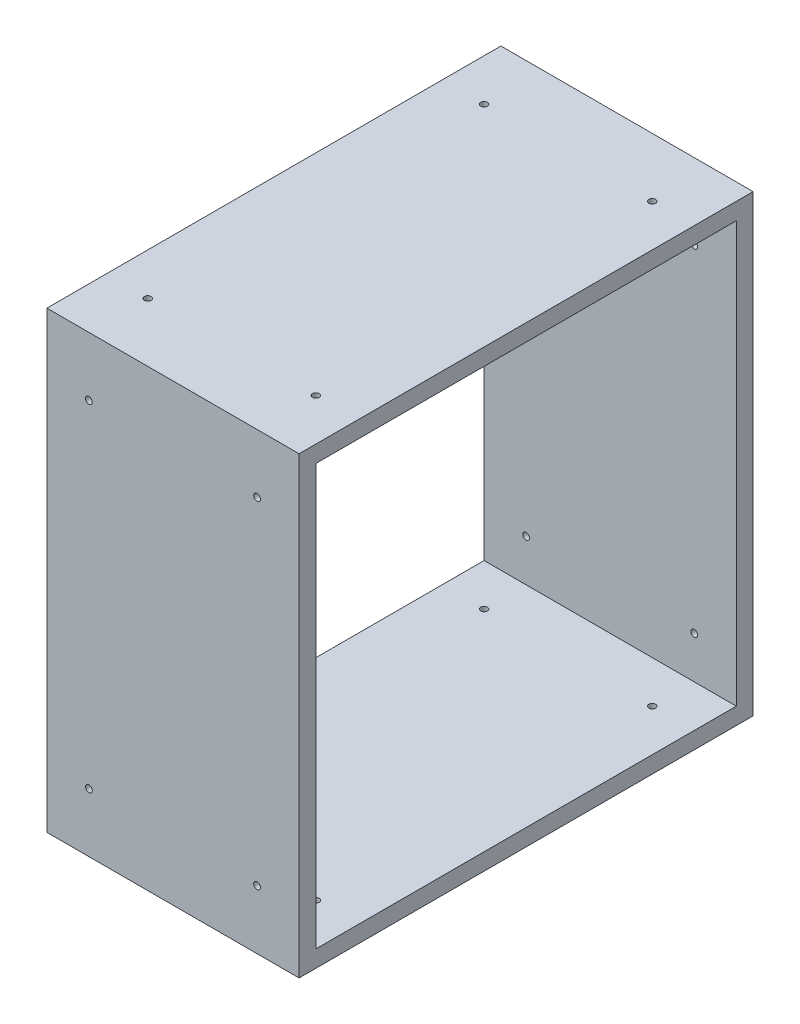
ISO-10303-21;
HEADER;
FILE_DESCRIPTION(('STEP AP214'),'2;1');
FILE_NAME('part.step','',(''),(''),'','','');
FILE_SCHEMA(('AUTOMOTIVE_DESIGN { 1 0 10303 214 1 1 1 1 }'));
ENDSEC;
DATA;
#1=APPLICATION_CONTEXT('core data for automotive mechanical design processes');
#2=APPLICATION_PROTOCOL_DEFINITION('international standard','automotive_design',2000,#1);
#3=PRODUCT_CONTEXT('',#1,'mechanical');
#4=PRODUCT('Part','Part','',(#3));
#5=PRODUCT_RELATED_PRODUCT_CATEGORY('part','',(#4));
#6=PRODUCT_DEFINITION_FORMATION('','',#4);
#7=PRODUCT_DEFINITION_CONTEXT('part definition',#1,'design');
#8=PRODUCT_DEFINITION('design','',#6,#7);
#9=PRODUCT_DEFINITION_SHAPE('','',#8);
#10=(LENGTH_UNIT() NAMED_UNIT(*) SI_UNIT(.MILLI.,.METRE.));
#11=(NAMED_UNIT(*) PLANE_ANGLE_UNIT() SI_UNIT($,.RADIAN.));
#12=(NAMED_UNIT(*) SI_UNIT($,.STERADIAN.) SOLID_ANGLE_UNIT());
#13=UNCERTAINTY_MEASURE_WITH_UNIT(LENGTH_MEASURE(1.E-05),#10,'distance_accuracy_value','');
#14=(GEOMETRIC_REPRESENTATION_CONTEXT(3) GLOBAL_UNCERTAINTY_ASSIGNED_CONTEXT((#13)) GLOBAL_UNIT_ASSIGNED_CONTEXT((#10,
#11,#12)) REPRESENTATION_CONTEXT('',''));
#15=CARTESIAN_POINT('',(0.,0.,0.));
#16=DIRECTION('',(0.,0.,1.));
#17=DIRECTION('',(1.,0.,0.));
#18=AXIS2_PLACEMENT_3D('',#15,#16,#17);
#19=CARTESIAN_POINT('',(300.,0.,250.));
#20=DIRECTION('',(0.,0.,1.));
#21=DIRECTION('',(0.,-1.,0.));
#22=AXIS2_PLACEMENT_3D('',#19,#20,#21);
#23=PLANE('',#22);
#24=CARTESIAN_POINT('',(250.,200.,250.));
#25=DIRECTION('',(0.,0.,-1.));
#26=DIRECTION('',(0.,1.,0.));
#27=AXIS2_PLACEMENT_3D('',#24,#25,#26);
#28=CIRCLE('',#27,3.99999999999999);
#29=CARTESIAN_POINT('',(250.,204.,250.));
#30=VERTEX_POINT('',#29);
#31=EDGE_CURVE('E224',#30,#30,#28,.T.);
#32=ORIENTED_EDGE('',*,*,#31,.F.);
#33=EDGE_LOOP('',(#32));
#34=FACE_BOUND('',#33,.T.);
#35=CARTESIAN_POINT('',(50.,200.,250.));
#36=DIRECTION('',(0.,0.,-1.));
#37=DIRECTION('',(0.,1.,0.));
#38=AXIS2_PLACEMENT_3D('',#35,#36,#37);
#39=CIRCLE('',#38,4.00000000000001);
#40=CARTESIAN_POINT('',(50.,204.,250.));
#41=VERTEX_POINT('',#40);
#42=EDGE_CURVE('E228',#41,#41,#39,.T.);
#43=ORIENTED_EDGE('',*,*,#42,.F.);
#44=EDGE_LOOP('',(#43));
#45=FACE_BOUND('',#44,.T.);
#46=DIRECTION('',(0.,1.,0.));
#47=VECTOR('',#46,1.);
#48=CARTESIAN_POINT('',(0.,0.,250.));
#49=LINE('',#48,#47);
#50=CARTESIAN_POINT('',(0.,-249.999999999998,250.000000000002));
#51=VERTEX_POINT('',#50);
#52=CARTESIAN_POINT('',(0.,250.000000000001,249.999999999999));
#53=VERTEX_POINT('',#52);
#54=EDGE_CURVE('E133',#51,#53,#49,.T.);
#55=ORIENTED_EDGE('',*,*,#54,.T.);
#56=DIRECTION('',(-1.,0.,0.));
#57=VECTOR('',#56,1.);
#58=CARTESIAN_POINT('',(300.,250.000000000001,249.999999999999));
#59=LINE('',#58,#57);
#60=CARTESIAN_POINT('',(300.,250.,250.));
#61=VERTEX_POINT('',#60);
#62=EDGE_CURVE('E216',#61,#53,#59,.T.);
#63=ORIENTED_EDGE('',*,*,#62,.F.);
#64=DIRECTION('',(0.,1.,0.));
#65=VECTOR('',#64,1.);
#66=CARTESIAN_POINT('',(300.,0.,250.));
#67=LINE('',#66,#65);
#68=CARTESIAN_POINT('',(300.,-249.999999999997,250.000000000003));
#69=VERTEX_POINT('',#68);
#70=EDGE_CURVE('E49',#69,#61,#67,.T.);
#71=ORIENTED_EDGE('',*,*,#70,.F.);
#72=DIRECTION('',(-1.,0.,0.));
#73=VECTOR('',#72,1.);
#74=CARTESIAN_POINT('',(300.,-249.999999999998,250.000000000002));
#75=LINE('',#74,#73);
#76=EDGE_CURVE('E150',#69,#51,#75,.T.);
#77=ORIENTED_EDGE('',*,*,#76,.T.);
#78=EDGE_LOOP('',(#55,#63,#71,#77));
#79=FACE_BOUND('',#78,.T.);
#80=CARTESIAN_POINT('',(250.,-199.999999999997,250.000000000002));
#81=DIRECTION('',(0.,0.,1.));
#82=DIRECTION('',(0.,-1.,0.));
#83=AXIS2_PLACEMENT_3D('',#80,#81,#82);
#84=CIRCLE('',#83,3.99999999999999);
#85=CARTESIAN_POINT('',(250.,-203.999999999997,250.000000000002));
#86=VERTEX_POINT('',#85);
#87=EDGE_CURVE('E152',#86,#86,#84,.T.);
#88=ORIENTED_EDGE('',*,*,#87,.T.);
#89=EDGE_LOOP('',(#88));
#90=FACE_BOUND('',#89,.T.);
#91=CARTESIAN_POINT('',(50.,-199.999999999997,250.000000000002));
#92=DIRECTION('',(0.,0.,1.));
#93=DIRECTION('',(0.,-1.,0.));
#94=AXIS2_PLACEMENT_3D('',#91,#92,#93);
#95=CIRCLE('',#94,4.00000000000001);
#96=CARTESIAN_POINT('',(50.,-203.999999999997,250.000000000002));
#97=VERTEX_POINT('',#96);
#98=EDGE_CURVE('E160',#97,#97,#95,.T.);
#99=ORIENTED_EDGE('',*,*,#98,.T.);
#100=EDGE_LOOP('',(#99));
#101=FACE_BOUND('',#100,.T.);
#102=ADVANCED_FACE('F41',(#34,#45,#79,#90,#101),#23,.F.);
#103=CARTESIAN_POINT('',(300.,0.,270.));
#104=DIRECTION('',(0.,0.,-1.));
#105=DIRECTION('',(-1.,0.,0.));
#106=AXIS2_PLACEMENT_3D('',#103,#104,#105);
#107=PLANE('',#106);
#108=CARTESIAN_POINT('',(250.,200.,270.));
#109=DIRECTION('',(0.,0.,-1.));
#110=DIRECTION('',(0.,1.,0.));
#111=AXIS2_PLACEMENT_3D('',#108,#109,#110);
#112=CIRCLE('',#111,3.99999999999999);
#113=CARTESIAN_POINT('',(250.,204.,270.));
#114=VERTEX_POINT('',#113);
#115=EDGE_CURVE('E219',#114,#114,#112,.T.);
#116=ORIENTED_EDGE('',*,*,#115,.T.);
#117=EDGE_LOOP('',(#116));
#118=FACE_BOUND('',#117,.T.);
#119=CARTESIAN_POINT('',(50.,200.,270.));
#120=DIRECTION('',(0.,0.,-1.));
#121=DIRECTION('',(0.,1.,0.));
#122=AXIS2_PLACEMENT_3D('',#119,#120,#121);
#123=CIRCLE('',#122,4.00000000000001);
#124=CARTESIAN_POINT('',(50.,204.,270.));
#125=VERTEX_POINT('',#124);
#126=EDGE_CURVE('E218',#125,#125,#123,.T.);
#127=ORIENTED_EDGE('',*,*,#126,.T.);
#128=EDGE_LOOP('',(#127));
#129=FACE_BOUND('',#128,.T.);
#130=DIRECTION('',(0.,-1.,0.));
#131=VECTOR('',#130,1.);
#132=CARTESIAN_POINT('',(0.,0.,270.));
#133=LINE('',#132,#131);
#134=CARTESIAN_POINT('',(0.,270.,270.));
#135=VERTEX_POINT('',#134);
#136=CARTESIAN_POINT('',(0.,-269.999999999997,270.000000000003));
#137=VERTEX_POINT('',#136);
#138=EDGE_CURVE('E42',#135,#137,#133,.T.);
#139=ORIENTED_EDGE('',*,*,#138,.T.);
#140=DIRECTION('',(-1.,0.,0.));
#141=VECTOR('',#140,1.);
#142=CARTESIAN_POINT('',(300.,-269.999999999998,270.000000000002));
#143=LINE('',#142,#141);
#144=CARTESIAN_POINT('',(300.,-269.999999999997,270.000000000003));
#145=VERTEX_POINT('',#144);
#146=EDGE_CURVE('E145',#145,#137,#143,.T.);
#147=ORIENTED_EDGE('',*,*,#146,.F.);
#148=DIRECTION('',(0.,-1.,0.));
#149=VECTOR('',#148,1.);
#150=CARTESIAN_POINT('',(300.,0.,270.));
#151=LINE('',#150,#149);
#152=CARTESIAN_POINT('',(300.,270.,270.));
#153=VERTEX_POINT('',#152);
#154=EDGE_CURVE('E11',#153,#145,#151,.T.);
#155=ORIENTED_EDGE('',*,*,#154,.F.);
#156=DIRECTION('',(-1.,0.,0.));
#157=VECTOR('',#156,1.);
#158=CARTESIAN_POINT('',(300.,270.000000000001,269.999999999999));
#159=LINE('',#158,#157);
#160=EDGE_CURVE('E215',#153,#135,#159,.T.);
#161=ORIENTED_EDGE('',*,*,#160,.T.);
#162=EDGE_LOOP('',(#139,#147,#155,#161));
#163=FACE_BOUND('',#162,.T.);
#164=CARTESIAN_POINT('',(250.,-199.999999999997,270.000000000002));
#165=DIRECTION('',(0.,0.,1.));
#166=DIRECTION('',(0.,-1.,0.));
#167=AXIS2_PLACEMENT_3D('',#164,#165,#166);
#168=CIRCLE('',#167,3.99999999999999);
#169=CARTESIAN_POINT('',(250.,-203.999999999997,270.000000000002));
#170=VERTEX_POINT('',#169);
#171=EDGE_CURVE('E147',#170,#170,#168,.T.);
#172=ORIENTED_EDGE('',*,*,#171,.F.);
#173=EDGE_LOOP('',(#172));
#174=FACE_BOUND('',#173,.T.);
#175=CARTESIAN_POINT('',(50.,-199.999999999997,270.000000000002));
#176=DIRECTION('',(0.,0.,1.));
#177=DIRECTION('',(0.,-1.,0.));
#178=AXIS2_PLACEMENT_3D('',#175,#176,#177);
#179=CIRCLE('',#178,4.00000000000001);
#180=CARTESIAN_POINT('',(50.,-203.999999999997,270.000000000002));
#181=VERTEX_POINT('',#180);
#182=EDGE_CURVE('E149',#181,#181,#179,.T.);
#183=ORIENTED_EDGE('',*,*,#182,.F.);
#184=EDGE_LOOP('',(#183));
#185=FACE_BOUND('',#184,.T.);
#186=ADVANCED_FACE('F235',(#118,#129,#163,#174,#185),#107,.F.);
#187=CARTESIAN_POINT('',(300.,0.,0.));
#188=DIRECTION('',(-1.,0.,0.));
#189=DIRECTION('',(0.,0.,1.));
#190=AXIS2_PLACEMENT_3D('',#187,#188,#189);
#191=PLANE('',#190);
#192=DIRECTION('',(0.,0.,1.));
#193=VECTOR('',#192,1.);
#194=CARTESIAN_POINT('',(300.,-250.,2.16607852201538E-12));
#195=LINE('',#194,#193);
#196=CARTESIAN_POINT('',(300.,-250.000000000001,-249.999999999999));
#197=VERTEX_POINT('',#196);
#198=EDGE_CURVE('E125',#197,#69,#195,.T.);
#199=ORIENTED_EDGE('',*,*,#198,.T.);
#200=ORIENTED_EDGE('',*,*,#70,.T.);
#201=DIRECTION('',(0.,0.,1.));
#202=VECTOR('',#201,1.);
#203=CARTESIAN_POINT('',(300.,250.,-6.82153756957095E-13));
#204=LINE('',#203,#202);
#205=CARTESIAN_POINT('',(300.,249.999999999999,-250.000000000001));
#206=VERTEX_POINT('',#205);
#207=EDGE_CURVE('E206',#206,#61,#204,.T.);
#208=ORIENTED_EDGE('',*,*,#207,.F.);
#209=DIRECTION('',(0.,1.,0.));
#210=VECTOR('',#209,1.);
#211=CARTESIAN_POINT('',(300.,-1.40951991168956E-12,-250.));
#212=LINE('',#211,#210);
#213=EDGE_CURVE('E186',#197,#206,#212,.T.);
#214=ORIENTED_EDGE('',*,*,#213,.F.);
#215=EDGE_LOOP('',(#199,#200,#208,#214));
#216=FACE_BOUND('',#215,.T.);
#217=ORIENTED_EDGE('',*,*,#154,.T.);
#218=DIRECTION('',(0.,0.,-1.));
#219=VECTOR('',#218,1.);
#220=CARTESIAN_POINT('',(300.,-270.,2.33819710555288E-12));
#221=LINE('',#220,#219);
#222=CARTESIAN_POINT('',(300.,-270.000000000002,-269.999999999998));
#223=VERTEX_POINT('',#222);
#224=EDGE_CURVE('E143',#145,#223,#221,.T.);
#225=ORIENTED_EDGE('',*,*,#224,.T.);
#226=DIRECTION('',(0.,-1.,0.));
#227=VECTOR('',#226,1.);
#228=CARTESIAN_POINT('',(300.,-1.52344920284846E-12,-270.));
#229=LINE('',#228,#227);
#230=CARTESIAN_POINT('',(300.,269.999999999999,-270.000000000002));
#231=VERTEX_POINT('',#230);
#232=EDGE_CURVE('E187',#231,#223,#229,.T.);
#233=ORIENTED_EDGE('',*,*,#232,.F.);
#234=DIRECTION('',(0.,0.,-1.));
#235=VECTOR('',#234,1.);
#236=CARTESIAN_POINT('',(300.,270.,-7.37893755737397E-13));
#237=LINE('',#236,#235);
#238=EDGE_CURVE('E207',#153,#231,#237,.T.);
#239=ORIENTED_EDGE('',*,*,#238,.F.);
#240=EDGE_LOOP('',(#217,#225,#233,#239));
#241=FACE_BOUND('',#240,.T.);
#242=ADVANCED_FACE('F318',(#216,#241),#191,.F.);
#243=CARTESIAN_POINT('',(0.,0.,0.));
#244=DIRECTION('',(-1.,0.,0.));
#245=DIRECTION('',(0.,0.,1.));
#246=AXIS2_PLACEMENT_3D('',#243,#244,#245);
#247=PLANE('',#246);
#248=ORIENTED_EDGE('',*,*,#54,.F.);
#249=DIRECTION('',(0.,0.,1.));
#250=VECTOR('',#249,1.);
#251=CARTESIAN_POINT('',(0.,-250.,2.16607852201538E-12));
#252=LINE('',#251,#250);
#253=CARTESIAN_POINT('',(0.,-250.000000000002,-249.999999999998));
#254=VERTEX_POINT('',#253);
#255=EDGE_CURVE('E122',#254,#51,#252,.T.);
#256=ORIENTED_EDGE('',*,*,#255,.F.);
#257=DIRECTION('',(0.,1.,0.));
#258=VECTOR('',#257,1.);
#259=CARTESIAN_POINT('',(0.,-1.40951991168956E-12,-250.));
#260=LINE('',#259,#258);
#261=CARTESIAN_POINT('',(0.,249.999999999999,-250.000000000001));
#262=VERTEX_POINT('',#261);
#263=EDGE_CURVE('E105',#254,#262,#260,.T.);
#264=ORIENTED_EDGE('',*,*,#263,.T.);
#265=DIRECTION('',(0.,0.,1.));
#266=VECTOR('',#265,1.);
#267=CARTESIAN_POINT('',(0.,250.,-6.82153756957095E-13));
#268=LINE('',#267,#266);
#269=EDGE_CURVE('E197',#262,#53,#268,.T.);
#270=ORIENTED_EDGE('',*,*,#269,.T.);
#271=EDGE_LOOP('',(#248,#256,#264,#270));
#272=FACE_BOUND('',#271,.T.);
#273=DIRECTION('',(0.,0.,-1.));
#274=VECTOR('',#273,1.);
#275=CARTESIAN_POINT('',(0.,-270.,2.33819710555288E-12));
#276=LINE('',#275,#274);
#277=CARTESIAN_POINT('',(0.,-270.000000000002,-269.999999999998));
#278=VERTEX_POINT('',#277);
#279=EDGE_CURVE('E135',#137,#278,#276,.T.);
#280=ORIENTED_EDGE('',*,*,#279,.F.);
#281=ORIENTED_EDGE('',*,*,#138,.F.);
#282=DIRECTION('',(0.,0.,-1.));
#283=VECTOR('',#282,1.);
#284=CARTESIAN_POINT('',(0.,270.,-7.37893755737397E-13));
#285=LINE('',#284,#283);
#286=CARTESIAN_POINT('',(0.,269.999999999999,-270.000000000002));
#287=VERTEX_POINT('',#286);
#288=EDGE_CURVE('E209',#135,#287,#285,.T.);
#289=ORIENTED_EDGE('',*,*,#288,.T.);
#290=DIRECTION('',(0.,-1.,0.));
#291=VECTOR('',#290,1.);
#292=CARTESIAN_POINT('',(0.,-1.52344920284846E-12,-270.));
#293=LINE('',#292,#291);
#294=EDGE_CURVE('E111',#287,#278,#293,.T.);
#295=ORIENTED_EDGE('',*,*,#294,.T.);
#296=EDGE_LOOP('',(#280,#281,#289,#295));
#297=FACE_BOUND('',#296,.T.);
#298=ADVANCED_FACE('F129',(#272,#297),#247,.T.);
#299=CARTESIAN_POINT('',(50.,200.,270.));
#300=DIRECTION('',(0.,0.,-1.));
#301=DIRECTION('',(0.,1.,0.));
#302=AXIS2_PLACEMENT_3D('',#299,#300,#301);
#303=CYLINDRICAL_SURFACE('',#302,4.00000000000001);
#304=ORIENTED_EDGE('',*,*,#126,.F.);
#305=EDGE_LOOP('',(#304));
#306=FACE_BOUND('',#305,.T.);
#307=ORIENTED_EDGE('',*,*,#42,.T.);
#308=EDGE_LOOP('',(#307));
#309=FACE_BOUND('',#308,.T.);
#310=ADVANCED_FACE('F376',(#306,#309),#303,.F.);
#311=CARTESIAN_POINT('',(250.,200.,270.));
#312=DIRECTION('',(0.,0.,-1.));
#313=DIRECTION('',(0.,1.,0.));
#314=AXIS2_PLACEMENT_3D('',#311,#312,#313);
#315=CYLINDRICAL_SURFACE('',#314,3.99999999999999);
#316=ORIENTED_EDGE('',*,*,#115,.F.);
#317=EDGE_LOOP('',(#316));
#318=FACE_BOUND('',#317,.T.);
#319=ORIENTED_EDGE('',*,*,#31,.T.);
#320=EDGE_LOOP('',(#319));
#321=FACE_BOUND('',#320,.T.);
#322=ADVANCED_FACE('F375',(#318,#321),#315,.F.);
#323=CARTESIAN_POINT('',(300.,250.,-6.82153756957095E-13));
#324=DIRECTION('',(0.,1.,0.));
#325=DIRECTION('',(0.,0.,-1.));
#326=AXIS2_PLACEMENT_3D('',#323,#324,#325);
#327=PLANE('',#326);
#328=CARTESIAN_POINT('',(250.,250.000000000001,199.999999999999));
#329=DIRECTION('',(0.,1.,0.));
#330=DIRECTION('',(0.,0.,1.));
#331=AXIS2_PLACEMENT_3D('',#328,#329,#330);
#332=CIRCLE('',#331,3.99999999999999);
#333=CARTESIAN_POINT('',(250.,250.000000000001,203.999999999999));
#334=VERTEX_POINT('',#333);
#335=EDGE_CURVE('E196',#334,#334,#332,.T.);
#336=ORIENTED_EDGE('',*,*,#335,.T.);
#337=EDGE_LOOP('',(#336));
#338=FACE_BOUND('',#337,.T.);
#339=CARTESIAN_POINT('',(50.,250.000000000001,199.999999999999));
#340=DIRECTION('',(0.,1.,0.));
#341=DIRECTION('',(0.,0.,1.));
#342=AXIS2_PLACEMENT_3D('',#339,#340,#341);
#343=CIRCLE('',#342,4.00000000000001);
#344=CARTESIAN_POINT('',(50.,250.000000000001,203.999999999999));
#345=VERTEX_POINT('',#344);
#346=EDGE_CURVE('E203',#345,#345,#343,.T.);
#347=ORIENTED_EDGE('',*,*,#346,.T.);
#348=EDGE_LOOP('',(#347));
#349=FACE_BOUND('',#348,.T.);
#350=ORIENTED_EDGE('',*,*,#269,.F.);
#351=DIRECTION('',(-1.,0.,0.));
#352=VECTOR('',#351,1.);
#353=CARTESIAN_POINT('',(300.,249.999999999999,-250.000000000001));
#354=LINE('',#353,#352);
#355=EDGE_CURVE('E109',#206,#262,#354,.T.);
#356=ORIENTED_EDGE('',*,*,#355,.F.);
#357=ORIENTED_EDGE('',*,*,#207,.T.);
#358=ORIENTED_EDGE('',*,*,#62,.T.);
#359=EDGE_LOOP('',(#350,#356,#357,#358));
#360=FACE_BOUND('',#359,.T.);
#361=CARTESIAN_POINT('',(250.,249.999999999999,-200.000000000001));
#362=DIRECTION('',(0.,-1.,0.));
#363=DIRECTION('',(0.,0.,-1.));
#364=AXIS2_PLACEMENT_3D('',#361,#362,#363);
#365=CIRCLE('',#364,3.99999999999999);
#366=CARTESIAN_POINT('',(250.,249.999999999999,-204.000000000001));
#367=VERTEX_POINT('',#366);
#368=EDGE_CURVE('E167',#367,#367,#365,.T.);
#369=ORIENTED_EDGE('',*,*,#368,.F.);
#370=EDGE_LOOP('',(#369));
#371=FACE_BOUND('',#370,.T.);
#372=CARTESIAN_POINT('',(50.,249.999999999999,-200.000000000001));
#373=DIRECTION('',(0.,-1.,0.));
#374=DIRECTION('',(0.,0.,-1.));
#375=AXIS2_PLACEMENT_3D('',#372,#373,#374);
#376=CIRCLE('',#375,4.00000000000001);
#377=CARTESIAN_POINT('',(50.,249.999999999999,-204.000000000001));
#378=VERTEX_POINT('',#377);
#379=EDGE_CURVE('E166',#378,#378,#376,.T.);
#380=ORIENTED_EDGE('',*,*,#379,.F.);
#381=EDGE_LOOP('',(#380));
#382=FACE_BOUND('',#381,.T.);
#383=ADVANCED_FACE('F366',(#338,#349,#360,#371,#382),#327,.F.);
#384=CARTESIAN_POINT('',(300.,270.,-7.37893755737397E-13));
#385=DIRECTION('',(0.,-1.,0.));
#386=DIRECTION('',(-1.,0.,0.));
#387=AXIS2_PLACEMENT_3D('',#384,#385,#386);
#388=PLANE('',#387);
#389=CARTESIAN_POINT('',(250.,270.000000000001,199.999999999999));
#390=DIRECTION('',(0.,1.,0.));
#391=DIRECTION('',(0.,0.,1.));
#392=AXIS2_PLACEMENT_3D('',#389,#390,#391);
#393=CIRCLE('',#392,3.99999999999999);
#394=CARTESIAN_POINT('',(250.,270.000000000001,203.999999999999));
#395=VERTEX_POINT('',#394);
#396=EDGE_CURVE('E193',#395,#395,#393,.T.);
#397=ORIENTED_EDGE('',*,*,#396,.F.);
#398=EDGE_LOOP('',(#397));
#399=FACE_BOUND('',#398,.T.);
#400=CARTESIAN_POINT('',(50.,270.000000000001,199.999999999999));
#401=DIRECTION('',(0.,1.,0.));
#402=DIRECTION('',(0.,0.,1.));
#403=AXIS2_PLACEMENT_3D('',#400,#401,#402);
#404=CIRCLE('',#403,4.00000000000001);
#405=CARTESIAN_POINT('',(50.,270.000000000001,203.999999999999));
#406=VERTEX_POINT('',#405);
#407=EDGE_CURVE('E191',#406,#406,#404,.T.);
#408=ORIENTED_EDGE('',*,*,#407,.F.);
#409=EDGE_LOOP('',(#408));
#410=FACE_BOUND('',#409,.T.);
#411=ORIENTED_EDGE('',*,*,#288,.F.);
#412=ORIENTED_EDGE('',*,*,#160,.F.);
#413=ORIENTED_EDGE('',*,*,#238,.T.);
#414=DIRECTION('',(-1.,0.,0.));
#415=VECTOR('',#414,1.);
#416=CARTESIAN_POINT('',(300.,269.999999999999,-270.000000000001));
#417=LINE('',#416,#415);
#418=EDGE_CURVE('E164',#231,#287,#417,.T.);
#419=ORIENTED_EDGE('',*,*,#418,.T.);
#420=EDGE_LOOP('',(#411,#412,#413,#419));
#421=FACE_BOUND('',#420,.T.);
#422=CARTESIAN_POINT('',(250.,269.999999999999,-200.000000000001));
#423=DIRECTION('',(0.,-1.,0.));
#424=DIRECTION('',(0.,0.,-1.));
#425=AXIS2_PLACEMENT_3D('',#422,#423,#424);
#426=CIRCLE('',#425,3.99999999999999);
#427=CARTESIAN_POINT('',(250.,269.999999999999,-204.000000000001));
#428=VERTEX_POINT('',#427);
#429=EDGE_CURVE('E165',#428,#428,#426,.T.);
#430=ORIENTED_EDGE('',*,*,#429,.T.);
#431=EDGE_LOOP('',(#430));
#432=FACE_BOUND('',#431,.T.);
#433=CARTESIAN_POINT('',(50.,269.999999999999,-200.000000000001));
#434=DIRECTION('',(0.,-1.,0.));
#435=DIRECTION('',(0.,0.,-1.));
#436=AXIS2_PLACEMENT_3D('',#433,#434,#435);
#437=CIRCLE('',#436,4.00000000000001);
#438=CARTESIAN_POINT('',(50.,269.999999999999,-204.000000000001));
#439=VERTEX_POINT('',#438);
#440=EDGE_CURVE('E153',#439,#439,#437,.T.);
#441=ORIENTED_EDGE('',*,*,#440,.T.);
#442=EDGE_LOOP('',(#441));
#443=FACE_BOUND('',#442,.T.);
#444=ADVANCED_FACE('F365',(#399,#410,#421,#432,#443),#388,.F.);
#445=CARTESIAN_POINT('',(50.,270.000000000001,199.999999999999));
#446=DIRECTION('',(0.,-1.,0.));
#447=DIRECTION('',(0.,0.,1.));
#448=AXIS2_PLACEMENT_3D('',#445,#446,#447);
#449=CYLINDRICAL_SURFACE('',#448,4.00000000000001);
#450=ORIENTED_EDGE('',*,*,#407,.T.);
#451=EDGE_LOOP('',(#450));
#452=FACE_BOUND('',#451,.T.);
#453=ORIENTED_EDGE('',*,*,#346,.F.);
#454=EDGE_LOOP('',(#453));
#455=FACE_BOUND('',#454,.T.);
#456=ADVANCED_FACE('F360',(#452,#455),#449,.F.);
#457=CARTESIAN_POINT('',(250.,270.000000000001,199.999999999999));
#458=DIRECTION('',(0.,-1.,0.));
#459=DIRECTION('',(0.,0.,1.));
#460=AXIS2_PLACEMENT_3D('',#457,#458,#459);
#461=CYLINDRICAL_SURFACE('',#460,3.99999999999999);
#462=ORIENTED_EDGE('',*,*,#396,.T.);
#463=EDGE_LOOP('',(#462));
#464=FACE_BOUND('',#463,.T.);
#465=ORIENTED_EDGE('',*,*,#335,.F.);
#466=EDGE_LOOP('',(#465));
#467=FACE_BOUND('',#466,.T.);
#468=ADVANCED_FACE('F356',(#464,#467),#461,.F.);
#469=CARTESIAN_POINT('',(300.,-1.40951991168956E-12,-250.));
#470=DIRECTION('',(0.,0.,-1.));
#471=DIRECTION('',(0.,-1.,0.));
#472=AXIS2_PLACEMENT_3D('',#469,#470,#471);
#473=PLANE('',#472);
#474=CARTESIAN_POINT('',(250.,199.999999999999,-250.000000000001));
#475=DIRECTION('',(0.,0.,-1.));
#476=DIRECTION('',(0.,1.,0.));
#477=AXIS2_PLACEMENT_3D('',#474,#475,#476);
#478=CIRCLE('',#477,3.99999999999999);
#479=CARTESIAN_POINT('',(250.,203.999999999999,-250.000000000001));
#480=VERTEX_POINT('',#479);
#481=EDGE_CURVE('E180',#480,#480,#478,.T.);
#482=ORIENTED_EDGE('',*,*,#481,.T.);
#483=EDGE_LOOP('',(#482));
#484=FACE_BOUND('',#483,.T.);
#485=CARTESIAN_POINT('',(50.,199.999999999999,-250.000000000001));
#486=DIRECTION('',(0.,0.,-1.));
#487=DIRECTION('',(0.,1.,0.));
#488=AXIS2_PLACEMENT_3D('',#485,#486,#487);
#489=CIRCLE('',#488,4.00000000000001);
#490=CARTESIAN_POINT('',(50.,203.999999999999,-250.000000000001));
#491=VERTEX_POINT('',#490);
#492=EDGE_CURVE('E181',#491,#491,#489,.T.);
#493=ORIENTED_EDGE('',*,*,#492,.T.);
#494=EDGE_LOOP('',(#493));
#495=FACE_BOUND('',#494,.T.);
#496=ORIENTED_EDGE('',*,*,#263,.F.);
#497=DIRECTION('',(-1.,0.,0.));
#498=VECTOR('',#497,1.);
#499=CARTESIAN_POINT('',(300.,-250.000000000002,-249.999999999998));
#500=LINE('',#499,#498);
#501=EDGE_CURVE('E110',#197,#254,#500,.T.);
#502=ORIENTED_EDGE('',*,*,#501,.F.);
#503=ORIENTED_EDGE('',*,*,#213,.T.);
#504=ORIENTED_EDGE('',*,*,#355,.T.);
#505=EDGE_LOOP('',(#496,#502,#503,#504));
#506=FACE_BOUND('',#505,.T.);
#507=CARTESIAN_POINT('',(250.,-200.000000000001,-249.999999999999));
#508=DIRECTION('',(0.,0.,1.));
#509=DIRECTION('',(0.,-1.,0.));
#510=AXIS2_PLACEMENT_3D('',#507,#508,#509);
#511=CIRCLE('',#510,3.99999999999999);
#512=CARTESIAN_POINT('',(250.,-204.000000000001,-249.999999999999));
#513=VERTEX_POINT('',#512);
#514=EDGE_CURVE('E264',#513,#513,#511,.T.);
#515=ORIENTED_EDGE('',*,*,#514,.F.);
#516=EDGE_LOOP('',(#515));
#517=FACE_BOUND('',#516,.T.);
#518=CARTESIAN_POINT('',(50.,-200.000000000001,-249.999999999999));
#519=DIRECTION('',(0.,0.,1.));
#520=DIRECTION('',(0.,-1.,0.));
#521=AXIS2_PLACEMENT_3D('',#518,#519,#520);
#522=CIRCLE('',#521,4.00000000000001);
#523=CARTESIAN_POINT('',(50.,-204.000000000001,-249.999999999999));
#524=VERTEX_POINT('',#523);
#525=EDGE_CURVE('E265',#524,#524,#522,.T.);
#526=ORIENTED_EDGE('',*,*,#525,.F.);
#527=EDGE_LOOP('',(#526));
#528=FACE_BOUND('',#527,.T.);
#529=ADVANCED_FACE('F102',(#484,#495,#506,#517,#528),#473,.F.);
#530=CARTESIAN_POINT('',(300.,-1.52344920284846E-12,-270.));
#531=DIRECTION('',(0.,0.,1.));
#532=DIRECTION('',(-1.,0.,0.));
#533=AXIS2_PLACEMENT_3D('',#530,#531,#532);
#534=PLANE('',#533);
#535=CARTESIAN_POINT('',(250.,199.999999999998,-270.000000000001));
#536=DIRECTION('',(0.,0.,-1.));
#537=DIRECTION('',(0.,1.,0.));
#538=AXIS2_PLACEMENT_3D('',#535,#536,#537);
#539=CIRCLE('',#538,3.99999999999999);
#540=CARTESIAN_POINT('',(250.,203.999999999998,-270.000000000001));
#541=VERTEX_POINT('',#540);
#542=EDGE_CURVE('E113',#541,#541,#539,.T.);
#543=ORIENTED_EDGE('',*,*,#542,.F.);
#544=EDGE_LOOP('',(#543));
#545=FACE_BOUND('',#544,.T.);
#546=CARTESIAN_POINT('',(50.,199.999999999998,-270.000000000001));
#547=DIRECTION('',(0.,0.,-1.));
#548=DIRECTION('',(0.,1.,0.));
#549=AXIS2_PLACEMENT_3D('',#546,#547,#548);
#550=CIRCLE('',#549,4.00000000000001);
#551=CARTESIAN_POINT('',(50.,203.999999999998,-270.000000000001));
#552=VERTEX_POINT('',#551);
#553=EDGE_CURVE('E177',#552,#552,#550,.T.);
#554=ORIENTED_EDGE('',*,*,#553,.F.);
#555=EDGE_LOOP('',(#554));
#556=FACE_BOUND('',#555,.T.);
#557=ORIENTED_EDGE('',*,*,#294,.F.);
#558=ORIENTED_EDGE('',*,*,#418,.F.);
#559=ORIENTED_EDGE('',*,*,#232,.T.);
#560=DIRECTION('',(-1.,0.,0.));
#561=VECTOR('',#560,1.);
#562=CARTESIAN_POINT('',(300.,-270.000000000002,-269.999999999998));
#563=LINE('',#562,#561);
#564=EDGE_CURVE('E130',#223,#278,#563,.T.);
#565=ORIENTED_EDGE('',*,*,#564,.T.);
#566=EDGE_LOOP('',(#557,#558,#559,#565));
#567=FACE_BOUND('',#566,.T.);
#568=CARTESIAN_POINT('',(250.,-200.000000000002,-269.999999999999));
#569=DIRECTION('',(0.,0.,1.));
#570=DIRECTION('',(0.,-1.,0.));
#571=AXIS2_PLACEMENT_3D('',#568,#569,#570);
#572=CIRCLE('',#571,3.99999999999999);
#573=CARTESIAN_POINT('',(250.,-204.000000000002,-269.999999999999));
#574=VERTEX_POINT('',#573);
#575=EDGE_CURVE('E254',#574,#574,#572,.T.);
#576=ORIENTED_EDGE('',*,*,#575,.T.);
#577=EDGE_LOOP('',(#576));
#578=FACE_BOUND('',#577,.T.);
#579=CARTESIAN_POINT('',(50.,-200.000000000002,-269.999999999999));
#580=DIRECTION('',(0.,0.,1.));
#581=DIRECTION('',(0.,-1.,0.));
#582=AXIS2_PLACEMENT_3D('',#579,#580,#581);
#583=CIRCLE('',#582,4.00000000000001);
#584=CARTESIAN_POINT('',(50.,-204.000000000002,-269.999999999999));
#585=VERTEX_POINT('',#584);
#586=EDGE_CURVE('E127',#585,#585,#583,.T.);
#587=ORIENTED_EDGE('',*,*,#586,.T.);
#588=EDGE_LOOP('',(#587));
#589=FACE_BOUND('',#588,.T.);
#590=ADVANCED_FACE('F348',(#545,#556,#567,#578,#589),#534,.F.);
#591=CARTESIAN_POINT('',(50.,199.999999999998,-270.000000000001));
#592=DIRECTION('',(0.,0.,1.));
#593=DIRECTION('',(0.,1.,0.));
#594=AXIS2_PLACEMENT_3D('',#591,#592,#593);
#595=CYLINDRICAL_SURFACE('',#594,4.00000000000001);
#596=ORIENTED_EDGE('',*,*,#553,.T.);
#597=EDGE_LOOP('',(#596));
#598=FACE_BOUND('',#597,.T.);
#599=ORIENTED_EDGE('',*,*,#492,.F.);
#600=EDGE_LOOP('',(#599));
#601=FACE_BOUND('',#600,.T.);
#602=ADVANCED_FACE('F347',(#598,#601),#595,.F.);
#603=CARTESIAN_POINT('',(250.,199.999999999998,-270.000000000001));
#604=DIRECTION('',(0.,0.,1.));
#605=DIRECTION('',(0.,1.,0.));
#606=AXIS2_PLACEMENT_3D('',#603,#604,#605);
#607=CYLINDRICAL_SURFACE('',#606,3.99999999999999);
#608=ORIENTED_EDGE('',*,*,#542,.T.);
#609=EDGE_LOOP('',(#608));
#610=FACE_BOUND('',#609,.T.);
#611=ORIENTED_EDGE('',*,*,#481,.F.);
#612=EDGE_LOOP('',(#611));
#613=FACE_BOUND('',#612,.T.);
#614=ADVANCED_FACE('F342',(#610,#613),#607,.F.);
#615=CARTESIAN_POINT('',(50.,269.999999999999,-200.000000000001));
#616=DIRECTION('',(0.,-1.,0.));
#617=DIRECTION('',(0.,0.,-1.));
#618=AXIS2_PLACEMENT_3D('',#615,#616,#617);
#619=CYLINDRICAL_SURFACE('',#618,4.00000000000001);
#620=ORIENTED_EDGE('',*,*,#440,.F.);
#621=EDGE_LOOP('',(#620));
#622=FACE_BOUND('',#621,.T.);
#623=ORIENTED_EDGE('',*,*,#379,.T.);
#624=EDGE_LOOP('',(#623));
#625=FACE_BOUND('',#624,.T.);
#626=ADVANCED_FACE('F338',(#622,#625),#619,.F.);
#627=CARTESIAN_POINT('',(250.,269.999999999999,-200.000000000001));
#628=DIRECTION('',(0.,-1.,0.));
#629=DIRECTION('',(0.,0.,-1.));
#630=AXIS2_PLACEMENT_3D('',#627,#628,#629);
#631=CYLINDRICAL_SURFACE('',#630,3.99999999999999);
#632=ORIENTED_EDGE('',*,*,#429,.F.);
#633=EDGE_LOOP('',(#632));
#634=FACE_BOUND('',#633,.T.);
#635=ORIENTED_EDGE('',*,*,#368,.T.);
#636=EDGE_LOOP('',(#635));
#637=FACE_BOUND('',#636,.T.);
#638=ADVANCED_FACE('F328',(#634,#637),#631,.F.);
#639=CARTESIAN_POINT('',(50.,-199.999999999997,270.000000000002));
#640=DIRECTION('',(0.,0.,-1.));
#641=DIRECTION('',(0.,-1.,0.));
#642=AXIS2_PLACEMENT_3D('',#639,#640,#641);
#643=CYLINDRICAL_SURFACE('',#642,4.00000000000001);
#644=ORIENTED_EDGE('',*,*,#182,.T.);
#645=EDGE_LOOP('',(#644));
#646=FACE_BOUND('',#645,.T.);
#647=ORIENTED_EDGE('',*,*,#98,.F.);
#648=EDGE_LOOP('',(#647));
#649=FACE_BOUND('',#648,.T.);
#650=ADVANCED_FACE('F307',(#646,#649),#643,.F.);
#651=CARTESIAN_POINT('',(250.,-199.999999999997,270.000000000002));
#652=DIRECTION('',(0.,0.,-1.));
#653=DIRECTION('',(0.,-1.,0.));
#654=AXIS2_PLACEMENT_3D('',#651,#652,#653);
#655=CYLINDRICAL_SURFACE('',#654,3.99999999999999);
#656=ORIENTED_EDGE('',*,*,#171,.T.);
#657=EDGE_LOOP('',(#656));
#658=FACE_BOUND('',#657,.T.);
#659=ORIENTED_EDGE('',*,*,#87,.F.);
#660=EDGE_LOOP('',(#659));
#661=FACE_BOUND('',#660,.T.);
#662=ADVANCED_FACE('F301',(#658,#661),#655,.F.);
#663=CARTESIAN_POINT('',(300.,-250.,2.16607852201538E-12));
#664=DIRECTION('',(0.,-1.,0.));
#665=DIRECTION('',(0.,0.,-1.));
#666=AXIS2_PLACEMENT_3D('',#663,#664,#665);
#667=PLANE('',#666);
#668=CARTESIAN_POINT('',(250.,-249.999999999998,200.000000000002));
#669=DIRECTION('',(0.,1.,0.));
#670=DIRECTION('',(0.,0.,1.));
#671=AXIS2_PLACEMENT_3D('',#668,#669,#670);
#672=CIRCLE('',#671,3.99999999999999);
#673=CARTESIAN_POINT('',(250.,-249.999999999998,204.000000000002));
#674=VERTEX_POINT('',#673);
#675=EDGE_CURVE('E139',#674,#674,#672,.T.);
#676=ORIENTED_EDGE('',*,*,#675,.F.);
#677=EDGE_LOOP('',(#676));
#678=FACE_BOUND('',#677,.T.);
#679=CARTESIAN_POINT('',(50.,-249.999999999998,200.000000000002));
#680=DIRECTION('',(0.,1.,0.));
#681=DIRECTION('',(0.,0.,1.));
#682=AXIS2_PLACEMENT_3D('',#679,#680,#681);
#683=CIRCLE('',#682,4.00000000000001);
#684=CARTESIAN_POINT('',(50.,-249.999999999998,204.000000000002));
#685=VERTEX_POINT('',#684);
#686=EDGE_CURVE('E255',#685,#685,#683,.T.);
#687=ORIENTED_EDGE('',*,*,#686,.F.);
#688=EDGE_LOOP('',(#687));
#689=FACE_BOUND('',#688,.T.);
#690=ORIENTED_EDGE('',*,*,#255,.T.);
#691=ORIENTED_EDGE('',*,*,#76,.F.);
#692=ORIENTED_EDGE('',*,*,#198,.F.);
#693=ORIENTED_EDGE('',*,*,#501,.T.);
#694=EDGE_LOOP('',(#690,#691,#692,#693));
#695=FACE_BOUND('',#694,.T.);
#696=CARTESIAN_POINT('',(250.,-250.000000000002,-199.999999999998));
#697=DIRECTION('',(0.,-1.,0.));
#698=DIRECTION('',(0.,0.,-1.));
#699=AXIS2_PLACEMENT_3D('',#696,#697,#698);
#700=CIRCLE('',#699,3.99999999999999);
#701=CARTESIAN_POINT('',(250.,-250.000000000002,-203.999999999998));
#702=VERTEX_POINT('',#701);
#703=EDGE_CURVE('E279',#702,#702,#700,.T.);
#704=ORIENTED_EDGE('',*,*,#703,.T.);
#705=EDGE_LOOP('',(#704));
#706=FACE_BOUND('',#705,.T.);
#707=CARTESIAN_POINT('',(50.,-250.000000000002,-199.999999999998));
#708=DIRECTION('',(0.,-1.,0.));
#709=DIRECTION('',(0.,0.,-1.));
#710=AXIS2_PLACEMENT_3D('',#707,#708,#709);
#711=CIRCLE('',#710,4.00000000000001);
#712=CARTESIAN_POINT('',(50.,-250.000000000002,-203.999999999998));
#713=VERTEX_POINT('',#712);
#714=EDGE_CURVE('E274',#713,#713,#711,.T.);
#715=ORIENTED_EDGE('',*,*,#714,.T.);
#716=EDGE_LOOP('',(#715));
#717=FACE_BOUND('',#716,.T.);
#718=ADVANCED_FACE('F119',(#678,#689,#695,#706,#717),#667,.F.);
#719=CARTESIAN_POINT('',(300.,-270.,2.33819710555288E-12));
#720=DIRECTION('',(0.,1.,0.));
#721=DIRECTION('',(-1.,0.,0.));
#722=AXIS2_PLACEMENT_3D('',#719,#720,#721);
#723=PLANE('',#722);
#724=CARTESIAN_POINT('',(250.,-269.999999999998,200.000000000002));
#725=DIRECTION('',(0.,1.,0.));
#726=DIRECTION('',(0.,0.,1.));
#727=AXIS2_PLACEMENT_3D('',#724,#725,#726);
#728=CIRCLE('',#727,3.99999999999999);
#729=CARTESIAN_POINT('',(250.,-269.999999999998,204.000000000002));
#730=VERTEX_POINT('',#729);
#731=EDGE_CURVE('E131',#730,#730,#728,.T.);
#732=ORIENTED_EDGE('',*,*,#731,.T.);
#733=EDGE_LOOP('',(#732));
#734=FACE_BOUND('',#733,.T.);
#735=CARTESIAN_POINT('',(50.,-269.999999999998,200.000000000002));
#736=DIRECTION('',(0.,1.,0.));
#737=DIRECTION('',(0.,0.,1.));
#738=AXIS2_PLACEMENT_3D('',#735,#736,#737);
#739=CIRCLE('',#738,4.00000000000001);
#740=CARTESIAN_POINT('',(50.,-269.999999999998,204.000000000002));
#741=VERTEX_POINT('',#740);
#742=EDGE_CURVE('E253',#741,#741,#739,.T.);
#743=ORIENTED_EDGE('',*,*,#742,.T.);
#744=EDGE_LOOP('',(#743));
#745=FACE_BOUND('',#744,.T.);
#746=ORIENTED_EDGE('',*,*,#279,.T.);
#747=ORIENTED_EDGE('',*,*,#564,.F.);
#748=ORIENTED_EDGE('',*,*,#224,.F.);
#749=ORIENTED_EDGE('',*,*,#146,.T.);
#750=EDGE_LOOP('',(#746,#747,#748,#749));
#751=FACE_BOUND('',#750,.T.);
#752=CARTESIAN_POINT('',(250.,-270.000000000002,-199.999999999998));
#753=DIRECTION('',(0.,-1.,0.));
#754=DIRECTION('',(0.,0.,-1.));
#755=AXIS2_PLACEMENT_3D('',#752,#753,#754);
#756=CIRCLE('',#755,3.99999999999999);
#757=CARTESIAN_POINT('',(250.,-270.000000000002,-203.999999999998));
#758=VERTEX_POINT('',#757);
#759=EDGE_CURVE('E271',#758,#758,#756,.T.);
#760=ORIENTED_EDGE('',*,*,#759,.F.);
#761=EDGE_LOOP('',(#760));
#762=FACE_BOUND('',#761,.T.);
#763=CARTESIAN_POINT('',(50.,-270.000000000002,-199.999999999998));
#764=DIRECTION('',(0.,-1.,0.));
#765=DIRECTION('',(0.,0.,-1.));
#766=AXIS2_PLACEMENT_3D('',#763,#764,#765);
#767=CIRCLE('',#766,4.00000000000001);
#768=CARTESIAN_POINT('',(50.,-270.000000000002,-203.999999999998));
#769=VERTEX_POINT('',#768);
#770=EDGE_CURVE('E275',#769,#769,#767,.T.);
#771=ORIENTED_EDGE('',*,*,#770,.F.);
#772=EDGE_LOOP('',(#771));
#773=FACE_BOUND('',#772,.T.);
#774=ADVANCED_FACE('F244',(#734,#745,#751,#762,#773),#723,.F.);
#775=CARTESIAN_POINT('',(50.,-269.999999999998,200.000000000002));
#776=DIRECTION('',(0.,1.,0.));
#777=DIRECTION('',(0.,0.,1.));
#778=AXIS2_PLACEMENT_3D('',#775,#776,#777);
#779=CYLINDRICAL_SURFACE('',#778,4.00000000000001);
#780=ORIENTED_EDGE('',*,*,#742,.F.);
#781=EDGE_LOOP('',(#780));
#782=FACE_BOUND('',#781,.T.);
#783=ORIENTED_EDGE('',*,*,#686,.T.);
#784=EDGE_LOOP('',(#783));
#785=FACE_BOUND('',#784,.T.);
#786=ADVANCED_FACE('F289',(#782,#785),#779,.F.);
#787=CARTESIAN_POINT('',(250.,-269.999999999998,200.000000000002));
#788=DIRECTION('',(0.,1.,0.));
#789=DIRECTION('',(0.,0.,1.));
#790=AXIS2_PLACEMENT_3D('',#787,#788,#789);
#791=CYLINDRICAL_SURFACE('',#790,3.99999999999999);
#792=ORIENTED_EDGE('',*,*,#731,.F.);
#793=EDGE_LOOP('',(#792));
#794=FACE_BOUND('',#793,.T.);
#795=ORIENTED_EDGE('',*,*,#675,.T.);
#796=EDGE_LOOP('',(#795));
#797=FACE_BOUND('',#796,.T.);
#798=ADVANCED_FACE('F434',(#794,#797),#791,.F.);
#799=CARTESIAN_POINT('',(50.,-200.000000000002,-269.999999999999));
#800=DIRECTION('',(0.,0.,1.));
#801=DIRECTION('',(0.,-1.,0.));
#802=AXIS2_PLACEMENT_3D('',#799,#800,#801);
#803=CYLINDRICAL_SURFACE('',#802,4.00000000000001);
#804=ORIENTED_EDGE('',*,*,#586,.F.);
#805=EDGE_LOOP('',(#804));
#806=FACE_BOUND('',#805,.T.);
#807=ORIENTED_EDGE('',*,*,#525,.T.);
#808=EDGE_LOOP('',(#807));
#809=FACE_BOUND('',#808,.T.);
#810=ADVANCED_FACE('F443',(#806,#809),#803,.F.);
#811=CARTESIAN_POINT('',(250.,-200.000000000002,-269.999999999999));
#812=DIRECTION('',(0.,0.,1.));
#813=DIRECTION('',(0.,-1.,0.));
#814=AXIS2_PLACEMENT_3D('',#811,#812,#813);
#815=CYLINDRICAL_SURFACE('',#814,3.99999999999999);
#816=ORIENTED_EDGE('',*,*,#575,.F.);
#817=EDGE_LOOP('',(#816));
#818=FACE_BOUND('',#817,.T.);
#819=ORIENTED_EDGE('',*,*,#514,.T.);
#820=EDGE_LOOP('',(#819));
#821=FACE_BOUND('',#820,.T.);
#822=ADVANCED_FACE('F298',(#818,#821),#815,.F.);
#823=CARTESIAN_POINT('',(50.,-270.000000000002,-199.999999999998));
#824=DIRECTION('',(0.,1.,0.));
#825=DIRECTION('',(0.,0.,-1.));
#826=AXIS2_PLACEMENT_3D('',#823,#824,#825);
#827=CYLINDRICAL_SURFACE('',#826,4.00000000000001);
#828=ORIENTED_EDGE('',*,*,#770,.T.);
#829=EDGE_LOOP('',(#828));
#830=FACE_BOUND('',#829,.T.);
#831=ORIENTED_EDGE('',*,*,#714,.F.);
#832=EDGE_LOOP('',(#831));
#833=FACE_BOUND('',#832,.T.);
#834=ADVANCED_FACE('F291',(#830,#833),#827,.F.);
#835=CARTESIAN_POINT('',(250.,-270.000000000002,-199.999999999998));
#836=DIRECTION('',(0.,1.,0.));
#837=DIRECTION('',(0.,0.,-1.));
#838=AXIS2_PLACEMENT_3D('',#835,#836,#837);
#839=CYLINDRICAL_SURFACE('',#838,3.99999999999999);
#840=ORIENTED_EDGE('',*,*,#759,.T.);
#841=EDGE_LOOP('',(#840));
#842=FACE_BOUND('',#841,.T.);
#843=ORIENTED_EDGE('',*,*,#703,.F.);
#844=EDGE_LOOP('',(#843));
#845=FACE_BOUND('',#844,.T.);
#846=ADVANCED_FACE('F284',(#842,#845),#839,.F.);
#847=CLOSED_SHELL('',(#102,#186,#242,#298,#310,#322,#383,#444,#456,#468,#529,#590,#602,#614,
#626,#638,#650,#662,#718,#774,#786,#798,#810,#822,#834,#846));
#848=MANIFOLD_SOLID_BREP('B2',#847);
#849=ADVANCED_BREP_SHAPE_REPRESENTATION('',(#18,#848),#14);
#850=SHAPE_DEFINITION_REPRESENTATION(#9,#849);
ENDSEC;
END-ISO-10303-21;
